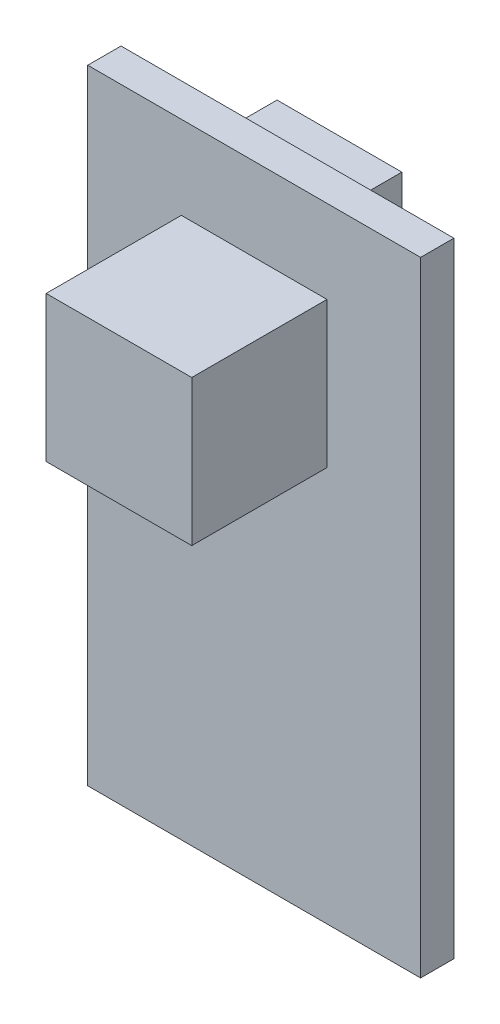
ISO-10303-21;
HEADER;
FILE_DESCRIPTION(('STEP AP214'),'2;1');
FILE_NAME('part.step','',(''),(''),'','','');
FILE_SCHEMA(('AUTOMOTIVE_DESIGN { 1 0 10303 214 1 1 1 1 }'));
ENDSEC;
DATA;
#1=APPLICATION_CONTEXT('core data for automotive mechanical design processes');
#2=APPLICATION_PROTOCOL_DEFINITION('international standard','automotive_design',2000,#1);
#3=PRODUCT_CONTEXT('',#1,'mechanical');
#4=PRODUCT('Part','Part','',(#3));
#5=PRODUCT_RELATED_PRODUCT_CATEGORY('part','',(#4));
#6=PRODUCT_DEFINITION_FORMATION('','',#4);
#7=PRODUCT_DEFINITION_CONTEXT('part definition',#1,'design');
#8=PRODUCT_DEFINITION('design','',#6,#7);
#9=PRODUCT_DEFINITION_SHAPE('','',#8);
#10=(LENGTH_UNIT() NAMED_UNIT(*) SI_UNIT(.MILLI.,.METRE.));
#11=(NAMED_UNIT(*) PLANE_ANGLE_UNIT() SI_UNIT($,.RADIAN.));
#12=(NAMED_UNIT(*) SI_UNIT($,.STERADIAN.) SOLID_ANGLE_UNIT());
#13=UNCERTAINTY_MEASURE_WITH_UNIT(LENGTH_MEASURE(1.E-05),#10,'distance_accuracy_value','');
#14=(GEOMETRIC_REPRESENTATION_CONTEXT(3) GLOBAL_UNCERTAINTY_ASSIGNED_CONTEXT((#13)) GLOBAL_UNIT_ASSIGNED_CONTEXT((#10,
#11,#12)) REPRESENTATION_CONTEXT('',''));
#15=CARTESIAN_POINT('',(0.,0.,0.));
#16=DIRECTION('',(0.,0.,1.));
#17=DIRECTION('',(1.,0.,0.));
#18=AXIS2_PLACEMENT_3D('',#15,#16,#17);
#19=CARTESIAN_POINT('',(0.,0.,14.7));
#20=DIRECTION('',(0.,0.,-1.));
#21=DIRECTION('',(-1.,0.,0.));
#22=AXIS2_PLACEMENT_3D('',#19,#20,#21);
#23=PLANE('',#22);
#24=DIRECTION('',(0.,1.,0.));
#25=VECTOR('',#24,1.);
#26=CARTESIAN_POINT('',(30.,-12.,14.7));
#27=LINE('',#26,#25);
#28=CARTESIAN_POINT('',(30.,-12.,14.7));
#29=VERTEX_POINT('',#28);
#30=CARTESIAN_POINT('',(30.,18.,14.7));
#31=VERTEX_POINT('',#30);
#32=EDGE_CURVE('E188',#29,#31,#27,.T.);
#33=ORIENTED_EDGE('',*,*,#32,.T.);
#34=DIRECTION('',(-1.,0.,0.));
#35=VECTOR('',#34,1.);
#36=CARTESIAN_POINT('',(14.,18.,14.7));
#37=LINE('',#36,#35);
#38=CARTESIAN_POINT('',(14.,18.,14.7));
#39=VERTEX_POINT('',#38);
#40=EDGE_CURVE('E191',#31,#39,#37,.T.);
#41=ORIENTED_EDGE('',*,*,#40,.T.);
#42=DIRECTION('',(0.,-1.,0.));
#43=VECTOR('',#42,1.);
#44=CARTESIAN_POINT('',(14.,-12.,14.7));
#45=LINE('',#44,#43);
#46=CARTESIAN_POINT('',(14.,-12.,14.7));
#47=VERTEX_POINT('',#46);
#48=EDGE_CURVE('E194',#39,#47,#45,.T.);
#49=ORIENTED_EDGE('',*,*,#48,.T.);
#50=DIRECTION('',(1.,0.,0.));
#51=VECTOR('',#50,1.);
#52=CARTESIAN_POINT('',(14.,-12.,14.7));
#53=LINE('',#52,#51);
#54=EDGE_CURVE('E196',#47,#29,#53,.T.);
#55=ORIENTED_EDGE('',*,*,#54,.T.);
#56=EDGE_LOOP('',(#33,#41,#49,#55));
#57=FACE_BOUND('',#56,.T.);
#58=DIRECTION('',(0.,1.,0.));
#59=VECTOR('',#58,1.);
#60=CARTESIAN_POINT('',(25.5,7.,14.7));
#61=LINE('',#60,#59);
#62=CARTESIAN_POINT('',(25.5,7.,14.7));
#63=VERTEX_POINT('',#62);
#64=CARTESIAN_POINT('',(25.5,14.,14.7));
#65=VERTEX_POINT('',#64);
#66=EDGE_CURVE('E148',#63,#65,#61,.T.);
#67=ORIENTED_EDGE('',*,*,#66,.F.);
#68=DIRECTION('',(1.,0.,0.));
#69=VECTOR('',#68,1.);
#70=CARTESIAN_POINT('',(18.5,7.,14.7));
#71=LINE('',#70,#69);
#72=CARTESIAN_POINT('',(18.5,7.,14.7));
#73=VERTEX_POINT('',#72);
#74=EDGE_CURVE('E145',#73,#63,#71,.T.);
#75=ORIENTED_EDGE('',*,*,#74,.F.);
#76=DIRECTION('',(0.,-1.,0.));
#77=VECTOR('',#76,1.);
#78=CARTESIAN_POINT('',(18.5,7.,14.7));
#79=LINE('',#78,#77);
#80=CARTESIAN_POINT('',(18.5,14.,14.7));
#81=VERTEX_POINT('',#80);
#82=EDGE_CURVE('E59',#81,#73,#79,.T.);
#83=ORIENTED_EDGE('',*,*,#82,.F.);
#84=DIRECTION('',(-1.,0.,0.));
#85=VECTOR('',#84,1.);
#86=CARTESIAN_POINT('',(18.5,14.,14.7));
#87=LINE('',#86,#85);
#88=EDGE_CURVE('E54',#65,#81,#87,.T.);
#89=ORIENTED_EDGE('',*,*,#88,.F.);
#90=EDGE_LOOP('',(#67,#75,#83,#89));
#91=FACE_BOUND('',#90,.T.);
#92=ADVANCED_FACE('F39',(#57,#91),#23,.F.);
#93=CARTESIAN_POINT('',(0.,0.,13.1));
#94=DIRECTION('',(0.,0.,-1.));
#95=DIRECTION('',(-1.,0.,0.));
#96=AXIS2_PLACEMENT_3D('',#93,#94,#95);
#97=PLANE('',#96);
#98=DIRECTION('',(0.,1.,0.));
#99=VECTOR('',#98,1.);
#100=CARTESIAN_POINT('',(30.,-12.,13.1));
#101=LINE('',#100,#99);
#102=CARTESIAN_POINT('',(30.,-12.,13.1));
#103=VERTEX_POINT('',#102);
#104=CARTESIAN_POINT('',(30.,18.,13.1));
#105=VERTEX_POINT('',#104);
#106=EDGE_CURVE('E187',#103,#105,#101,.T.);
#107=ORIENTED_EDGE('',*,*,#106,.F.);
#108=DIRECTION('',(1.,0.,0.));
#109=VECTOR('',#108,1.);
#110=CARTESIAN_POINT('',(14.,-12.,13.1));
#111=LINE('',#110,#109);
#112=CARTESIAN_POINT('',(14.,-12.,13.1));
#113=VERTEX_POINT('',#112);
#114=EDGE_CURVE('E192',#113,#103,#111,.T.);
#115=ORIENTED_EDGE('',*,*,#114,.F.);
#116=DIRECTION('',(0.,-1.,0.));
#117=VECTOR('',#116,1.);
#118=CARTESIAN_POINT('',(14.,-12.,13.1));
#119=LINE('',#118,#117);
#120=CARTESIAN_POINT('',(14.,18.,13.1));
#121=VERTEX_POINT('',#120);
#122=EDGE_CURVE('E203',#121,#113,#119,.T.);
#123=ORIENTED_EDGE('',*,*,#122,.F.);
#124=DIRECTION('',(-1.,0.,0.));
#125=VECTOR('',#124,1.);
#126=CARTESIAN_POINT('',(14.,18.,13.1));
#127=LINE('',#126,#125);
#128=EDGE_CURVE('E201',#105,#121,#127,.T.);
#129=ORIENTED_EDGE('',*,*,#128,.F.);
#130=EDGE_LOOP('',(#107,#115,#123,#129));
#131=FACE_BOUND('',#130,.T.);
#132=DIRECTION('',(1.,0.,0.));
#133=VECTOR('',#132,1.);
#134=CARTESIAN_POINT('',(19.,-11.,13.1));
#135=LINE('',#134,#133);
#136=CARTESIAN_POINT('',(19.,-11.,13.1));
#137=VERTEX_POINT('',#136);
#138=CARTESIAN_POINT('',(25.,-11.,13.1));
#139=VERTEX_POINT('',#138);
#140=EDGE_CURVE('E168',#137,#139,#135,.T.);
#141=ORIENTED_EDGE('',*,*,#140,.T.);
#142=DIRECTION('',(0.,1.,0.));
#143=VECTOR('',#142,1.);
#144=CARTESIAN_POINT('',(25.,-11.,13.1));
#145=LINE('',#144,#143);
#146=CARTESIAN_POINT('',(25.,17.,13.1));
#147=VERTEX_POINT('',#146);
#148=EDGE_CURVE('E158',#139,#147,#145,.T.);
#149=ORIENTED_EDGE('',*,*,#148,.T.);
#150=DIRECTION('',(-1.,0.,0.));
#151=VECTOR('',#150,1.);
#152=CARTESIAN_POINT('',(19.,17.,13.1));
#153=LINE('',#152,#151);
#154=CARTESIAN_POINT('',(19.,17.,13.1));
#155=VERTEX_POINT('',#154);
#156=EDGE_CURVE('E161',#147,#155,#153,.T.);
#157=ORIENTED_EDGE('',*,*,#156,.T.);
#158=DIRECTION('',(0.,-1.,0.));
#159=VECTOR('',#158,1.);
#160=CARTESIAN_POINT('',(19.,-11.,13.1));
#161=LINE('',#160,#159);
#162=EDGE_CURVE('E165',#155,#137,#161,.T.);
#163=ORIENTED_EDGE('',*,*,#162,.T.);
#164=EDGE_LOOP('',(#141,#149,#157,#163));
#165=FACE_BOUND('',#164,.T.);
#166=ADVANCED_FACE('F221',(#131,#165),#97,.T.);
#167=CARTESIAN_POINT('',(30.,-12.,14.7));
#168=DIRECTION('',(-1.,0.,0.));
#169=DIRECTION('',(0.,0.,1.));
#170=AXIS2_PLACEMENT_3D('',#167,#168,#169);
#171=PLANE('',#170);
#172=ORIENTED_EDGE('',*,*,#106,.T.);
#173=DIRECTION('',(0.,0.,-1.));
#174=VECTOR('',#173,1.);
#175=CARTESIAN_POINT('',(30.,18.,14.7));
#176=LINE('',#175,#174);
#177=EDGE_CURVE('E11',#31,#105,#176,.T.);
#178=ORIENTED_EDGE('',*,*,#177,.F.);
#179=ORIENTED_EDGE('',*,*,#32,.F.);
#180=DIRECTION('',(0.,0.,-1.));
#181=VECTOR('',#180,1.);
#182=CARTESIAN_POINT('',(30.,-12.,14.7));
#183=LINE('',#182,#181);
#184=EDGE_CURVE('E198',#29,#103,#183,.T.);
#185=ORIENTED_EDGE('',*,*,#184,.T.);
#186=EDGE_LOOP('',(#172,#178,#179,#185));
#187=FACE_BOUND('',#186,.T.);
#188=ADVANCED_FACE('F41',(#187),#171,.F.);
#189=CARTESIAN_POINT('',(14.,18.,14.7));
#190=DIRECTION('',(0.,-1.,0.));
#191=DIRECTION('',(0.,0.,-1.));
#192=AXIS2_PLACEMENT_3D('',#189,#190,#191);
#193=PLANE('',#192);
#194=ORIENTED_EDGE('',*,*,#128,.T.);
#195=DIRECTION('',(0.,0.,-1.));
#196=VECTOR('',#195,1.);
#197=CARTESIAN_POINT('',(14.,18.,14.7));
#198=LINE('',#197,#196);
#199=EDGE_CURVE('E47',#39,#121,#198,.T.);
#200=ORIENTED_EDGE('',*,*,#199,.F.);
#201=ORIENTED_EDGE('',*,*,#40,.F.);
#202=ORIENTED_EDGE('',*,*,#177,.T.);
#203=EDGE_LOOP('',(#194,#200,#201,#202));
#204=FACE_BOUND('',#203,.T.);
#205=ADVANCED_FACE('F231',(#204),#193,.F.);
#206=CARTESIAN_POINT('',(14.,-12.,14.7));
#207=DIRECTION('',(1.,0.,0.));
#208=DIRECTION('',(0.,0.,-1.));
#209=AXIS2_PLACEMENT_3D('',#206,#207,#208);
#210=PLANE('',#209);
#211=ORIENTED_EDGE('',*,*,#122,.T.);
#212=DIRECTION('',(0.,0.,-1.));
#213=VECTOR('',#212,1.);
#214=CARTESIAN_POINT('',(14.,-12.,14.7));
#215=LINE('',#214,#213);
#216=EDGE_CURVE('E208',#47,#113,#215,.T.);
#217=ORIENTED_EDGE('',*,*,#216,.F.);
#218=ORIENTED_EDGE('',*,*,#48,.F.);
#219=ORIENTED_EDGE('',*,*,#199,.T.);
#220=EDGE_LOOP('',(#211,#217,#218,#219));
#221=FACE_BOUND('',#220,.T.);
#222=ADVANCED_FACE('F215',(#221),#210,.F.);
#223=CARTESIAN_POINT('',(14.,-12.,14.7));
#224=DIRECTION('',(0.,1.,0.));
#225=DIRECTION('',(0.,0.,1.));
#226=AXIS2_PLACEMENT_3D('',#223,#224,#225);
#227=PLANE('',#226);
#228=ORIENTED_EDGE('',*,*,#114,.T.);
#229=ORIENTED_EDGE('',*,*,#184,.F.);
#230=ORIENTED_EDGE('',*,*,#54,.F.);
#231=ORIENTED_EDGE('',*,*,#216,.T.);
#232=EDGE_LOOP('',(#228,#229,#230,#231));
#233=FACE_BOUND('',#232,.T.);
#234=ADVANCED_FACE('F225',(#233),#227,.F.);
#235=CARTESIAN_POINT('',(25.,-11.,13.1));
#236=DIRECTION('',(-1.,0.,0.));
#237=DIRECTION('',(0.,0.,1.));
#238=AXIS2_PLACEMENT_3D('',#235,#236,#237);
#239=PLANE('',#238);
#240=DIRECTION('',(0.,1.,0.));
#241=VECTOR('',#240,1.);
#242=CARTESIAN_POINT('',(25.,-11.,10.6));
#243=LINE('',#242,#241);
#244=CARTESIAN_POINT('',(25.,-11.,10.6));
#245=VERTEX_POINT('',#244);
#246=CARTESIAN_POINT('',(25.,17.,10.6));
#247=VERTEX_POINT('',#246);
#248=EDGE_CURVE('E149',#245,#247,#243,.T.);
#249=ORIENTED_EDGE('',*,*,#248,.T.);
#250=DIRECTION('',(0.,0.,-1.));
#251=VECTOR('',#250,1.);
#252=CARTESIAN_POINT('',(25.,17.,13.1));
#253=LINE('',#252,#251);
#254=EDGE_CURVE('E184',#147,#247,#253,.T.);
#255=ORIENTED_EDGE('',*,*,#254,.F.);
#256=ORIENTED_EDGE('',*,*,#148,.F.);
#257=DIRECTION('',(0.,0.,-1.));
#258=VECTOR('',#257,1.);
#259=CARTESIAN_POINT('',(25.,-11.,13.1));
#260=LINE('',#259,#258);
#261=EDGE_CURVE('E170',#139,#245,#260,.T.);
#262=ORIENTED_EDGE('',*,*,#261,.T.);
#263=EDGE_LOOP('',(#249,#255,#256,#262));
#264=FACE_BOUND('',#263,.T.);
#265=ADVANCED_FACE('F245',(#264),#239,.F.);
#266=CARTESIAN_POINT('',(19.,17.,13.1));
#267=DIRECTION('',(0.,-1.,0.));
#268=DIRECTION('',(0.,0.,-1.));
#269=AXIS2_PLACEMENT_3D('',#266,#267,#268);
#270=PLANE('',#269);
#271=DIRECTION('',(-1.,0.,0.));
#272=VECTOR('',#271,1.);
#273=CARTESIAN_POINT('',(19.,17.,10.6));
#274=LINE('',#273,#272);
#275=CARTESIAN_POINT('',(19.,17.,10.6));
#276=VERTEX_POINT('',#275);
#277=EDGE_CURVE('E152',#247,#276,#274,.T.);
#278=ORIENTED_EDGE('',*,*,#277,.T.);
#279=DIRECTION('',(0.,0.,-1.));
#280=VECTOR('',#279,1.);
#281=CARTESIAN_POINT('',(19.,17.,13.1));
#282=LINE('',#281,#280);
#283=EDGE_CURVE('E181',#155,#276,#282,.T.);
#284=ORIENTED_EDGE('',*,*,#283,.F.);
#285=ORIENTED_EDGE('',*,*,#156,.F.);
#286=ORIENTED_EDGE('',*,*,#254,.T.);
#287=EDGE_LOOP('',(#278,#284,#285,#286));
#288=FACE_BOUND('',#287,.T.);
#289=ADVANCED_FACE('F252',(#288),#270,.F.);
#290=CARTESIAN_POINT('',(19.,-11.,13.1));
#291=DIRECTION('',(1.,0.,0.));
#292=DIRECTION('',(0.,0.,-1.));
#293=AXIS2_PLACEMENT_3D('',#290,#291,#292);
#294=PLANE('',#293);
#295=DIRECTION('',(0.,-1.,0.));
#296=VECTOR('',#295,1.);
#297=CARTESIAN_POINT('',(19.,-11.,10.6));
#298=LINE('',#297,#296);
#299=CARTESIAN_POINT('',(19.,-11.,10.6));
#300=VERTEX_POINT('',#299);
#301=EDGE_CURVE('E173',#276,#300,#298,.T.);
#302=ORIENTED_EDGE('',*,*,#301,.T.);
#303=DIRECTION('',(0.,0.,-1.));
#304=VECTOR('',#303,1.);
#305=CARTESIAN_POINT('',(19.,-11.,13.1));
#306=LINE('',#305,#304);
#307=EDGE_CURVE('E178',#137,#300,#306,.T.);
#308=ORIENTED_EDGE('',*,*,#307,.F.);
#309=ORIENTED_EDGE('',*,*,#162,.F.);
#310=ORIENTED_EDGE('',*,*,#283,.T.);
#311=EDGE_LOOP('',(#302,#308,#309,#310));
#312=FACE_BOUND('',#311,.T.);
#313=ADVANCED_FACE('F257',(#312),#294,.F.);
#314=CARTESIAN_POINT('',(19.,-11.,13.1));
#315=DIRECTION('',(0.,1.,0.));
#316=DIRECTION('',(0.,0.,1.));
#317=AXIS2_PLACEMENT_3D('',#314,#315,#316);
#318=PLANE('',#317);
#319=DIRECTION('',(1.,0.,0.));
#320=VECTOR('',#319,1.);
#321=CARTESIAN_POINT('',(19.,-11.,10.6));
#322=LINE('',#321,#320);
#323=EDGE_CURVE('E162',#300,#245,#322,.T.);
#324=ORIENTED_EDGE('',*,*,#323,.T.);
#325=ORIENTED_EDGE('',*,*,#261,.F.);
#326=ORIENTED_EDGE('',*,*,#140,.F.);
#327=ORIENTED_EDGE('',*,*,#307,.T.);
#328=EDGE_LOOP('',(#324,#325,#326,#327));
#329=FACE_BOUND('',#328,.T.);
#330=ADVANCED_FACE('F269',(#329),#318,.F.);
#331=CARTESIAN_POINT('',(0.,0.,10.6));
#332=DIRECTION('',(0.,0.,-1.));
#333=DIRECTION('',(-1.,0.,0.));
#334=AXIS2_PLACEMENT_3D('',#331,#332,#333);
#335=PLANE('',#334);
#336=ORIENTED_EDGE('',*,*,#248,.F.);
#337=ORIENTED_EDGE('',*,*,#323,.F.);
#338=ORIENTED_EDGE('',*,*,#301,.F.);
#339=ORIENTED_EDGE('',*,*,#277,.F.);
#340=EDGE_LOOP('',(#336,#337,#338,#339));
#341=FACE_BOUND('',#340,.T.);
#342=ADVANCED_FACE('F264',(#341),#335,.T.);
#343=CARTESIAN_POINT('',(25.5,7.,21.2));
#344=DIRECTION('',(-1.,0.,0.));
#345=DIRECTION('',(0.,0.,1.));
#346=AXIS2_PLACEMENT_3D('',#343,#344,#345);
#347=PLANE('',#346);
#348=ORIENTED_EDGE('',*,*,#66,.T.);
#349=DIRECTION('',(0.,0.,-1.));
#350=VECTOR('',#349,1.);
#351=CARTESIAN_POINT('',(25.5,14.,21.2));
#352=LINE('',#351,#350);
#353=CARTESIAN_POINT('',(25.5,14.,21.2));
#354=VERTEX_POINT('',#353);
#355=EDGE_CURVE('E129',#354,#65,#352,.T.);
#356=ORIENTED_EDGE('',*,*,#355,.F.);
#357=DIRECTION('',(0.,1.,0.));
#358=VECTOR('',#357,1.);
#359=CARTESIAN_POINT('',(25.5,7.,21.2));
#360=LINE('',#359,#358);
#361=CARTESIAN_POINT('',(25.5,7.,21.2));
#362=VERTEX_POINT('',#361);
#363=EDGE_CURVE('E136',#362,#354,#360,.T.);
#364=ORIENTED_EDGE('',*,*,#363,.F.);
#365=DIRECTION('',(0.,0.,-1.));
#366=VECTOR('',#365,1.);
#367=CARTESIAN_POINT('',(25.5,7.,21.2));
#368=LINE('',#367,#366);
#369=EDGE_CURVE('E445',#362,#63,#368,.T.);
#370=ORIENTED_EDGE('',*,*,#369,.T.);
#371=EDGE_LOOP('',(#348,#356,#364,#370));
#372=FACE_BOUND('',#371,.T.);
#373=ADVANCED_FACE('F147',(#372),#347,.F.);
#374=CARTESIAN_POINT('',(18.5,14.,21.2));
#375=DIRECTION('',(0.,-1.,0.));
#376=DIRECTION('',(0.,0.,-1.));
#377=AXIS2_PLACEMENT_3D('',#374,#375,#376);
#378=PLANE('',#377);
#379=ORIENTED_EDGE('',*,*,#88,.T.);
#380=DIRECTION('',(0.,0.,-1.));
#381=VECTOR('',#380,1.);
#382=CARTESIAN_POINT('',(18.5,14.,21.2));
#383=LINE('',#382,#381);
#384=CARTESIAN_POINT('',(18.5,14.,21.2));
#385=VERTEX_POINT('',#384);
#386=EDGE_CURVE('E132',#385,#81,#383,.T.);
#387=ORIENTED_EDGE('',*,*,#386,.F.);
#388=DIRECTION('',(-1.,0.,0.));
#389=VECTOR('',#388,1.);
#390=CARTESIAN_POINT('',(18.5,14.,21.2));
#391=LINE('',#390,#389);
#392=EDGE_CURVE('E125',#354,#385,#391,.T.);
#393=ORIENTED_EDGE('',*,*,#392,.F.);
#394=ORIENTED_EDGE('',*,*,#355,.T.);
#395=EDGE_LOOP('',(#379,#387,#393,#394));
#396=FACE_BOUND('',#395,.T.);
#397=ADVANCED_FACE('F127',(#396),#378,.F.);
#398=CARTESIAN_POINT('',(18.5,7.,21.2));
#399=DIRECTION('',(1.,0.,0.));
#400=DIRECTION('',(0.,0.,-1.));
#401=AXIS2_PLACEMENT_3D('',#398,#399,#400);
#402=PLANE('',#401);
#403=ORIENTED_EDGE('',*,*,#82,.T.);
#404=DIRECTION('',(0.,0.,-1.));
#405=VECTOR('',#404,1.);
#406=CARTESIAN_POINT('',(18.5,7.,21.2));
#407=LINE('',#406,#405);
#408=CARTESIAN_POINT('',(18.5,7.,21.2));
#409=VERTEX_POINT('',#408);
#410=EDGE_CURVE('E154',#409,#73,#407,.T.);
#411=ORIENTED_EDGE('',*,*,#410,.F.);
#412=DIRECTION('',(0.,-1.,0.));
#413=VECTOR('',#412,1.);
#414=CARTESIAN_POINT('',(18.5,7.,21.2));
#415=LINE('',#414,#413);
#416=EDGE_CURVE('E135',#385,#409,#415,.T.);
#417=ORIENTED_EDGE('',*,*,#416,.F.);
#418=ORIENTED_EDGE('',*,*,#386,.T.);
#419=EDGE_LOOP('',(#403,#411,#417,#418));
#420=FACE_BOUND('',#419,.T.);
#421=ADVANCED_FACE('F284',(#420),#402,.F.);
#422=CARTESIAN_POINT('',(18.5,7.,21.2));
#423=DIRECTION('',(0.,1.,0.));
#424=DIRECTION('',(0.,0.,1.));
#425=AXIS2_PLACEMENT_3D('',#422,#423,#424);
#426=PLANE('',#425);
#427=ORIENTED_EDGE('',*,*,#74,.T.);
#428=ORIENTED_EDGE('',*,*,#369,.F.);
#429=DIRECTION('',(1.,0.,0.));
#430=VECTOR('',#429,1.);
#431=CARTESIAN_POINT('',(18.5,7.,21.2));
#432=LINE('',#431,#430);
#433=EDGE_CURVE('E141',#409,#362,#432,.T.);
#434=ORIENTED_EDGE('',*,*,#433,.F.);
#435=ORIENTED_EDGE('',*,*,#410,.T.);
#436=EDGE_LOOP('',(#427,#428,#434,#435));
#437=FACE_BOUND('',#436,.T.);
#438=ADVANCED_FACE('F287',(#437),#426,.F.);
#439=CARTESIAN_POINT('',(0.,0.,21.2));
#440=DIRECTION('',(0.,0.,-1.));
#441=DIRECTION('',(-1.,0.,0.));
#442=AXIS2_PLACEMENT_3D('',#439,#440,#441);
#443=PLANE('',#442);
#444=ORIENTED_EDGE('',*,*,#363,.T.);
#445=ORIENTED_EDGE('',*,*,#392,.T.);
#446=ORIENTED_EDGE('',*,*,#416,.T.);
#447=ORIENTED_EDGE('',*,*,#433,.T.);
#448=EDGE_LOOP('',(#444,#445,#446,#447));
#449=FACE_BOUND('',#448,.T.);
#450=ADVANCED_FACE('F139',(#449),#443,.F.);
#451=CLOSED_SHELL('',(#92,#166,#188,#205,#222,#234,#265,#289,#313,#330,#342,#373,#397,#421,#438,#450));
#452=MANIFOLD_SOLID_BREP('B2',#451);
#453=ADVANCED_BREP_SHAPE_REPRESENTATION('',(#18,#452),#14);
#454=SHAPE_DEFINITION_REPRESENTATION(#9,#453);
ENDSEC;
END-ISO-10303-21;
